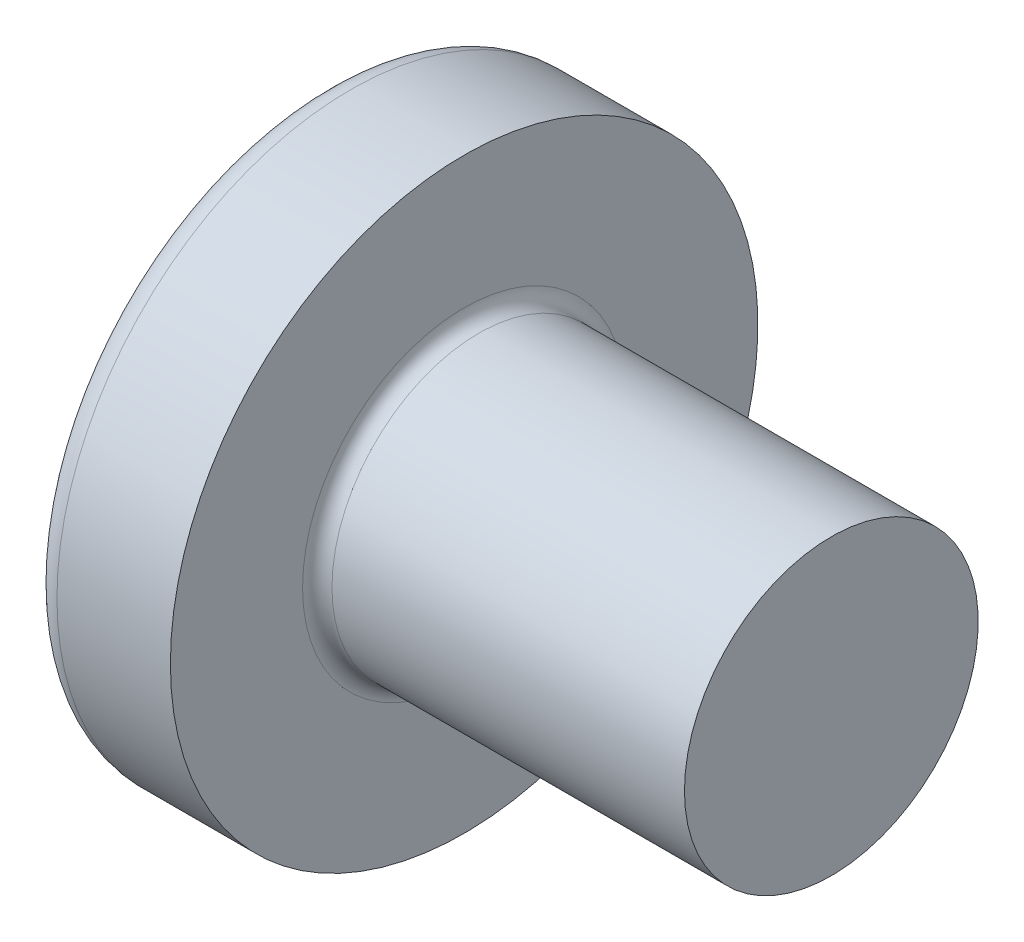
ISO-10303-21;
HEADER;
FILE_DESCRIPTION(('STEP AP214'),'2;1');
FILE_NAME('part.step','',(''),(''),'','','');
FILE_SCHEMA(('AUTOMOTIVE_DESIGN { 1 0 10303 214 1 1 1 1 }'));
ENDSEC;
DATA;
#1=APPLICATION_CONTEXT('core data for automotive mechanical design processes');
#2=APPLICATION_PROTOCOL_DEFINITION('international standard','automotive_design',2000,#1);
#3=PRODUCT_CONTEXT('',#1,'mechanical');
#4=PRODUCT('Part','Part','',(#3));
#5=PRODUCT_RELATED_PRODUCT_CATEGORY('part','',(#4));
#6=PRODUCT_DEFINITION_FORMATION('','',#4);
#7=PRODUCT_DEFINITION_CONTEXT('part definition',#1,'design');
#8=PRODUCT_DEFINITION('design','',#6,#7);
#9=PRODUCT_DEFINITION_SHAPE('','',#8);
#10=(LENGTH_UNIT() NAMED_UNIT(*) SI_UNIT(.MILLI.,.METRE.));
#11=(NAMED_UNIT(*) PLANE_ANGLE_UNIT() SI_UNIT($,.RADIAN.));
#12=(NAMED_UNIT(*) SI_UNIT($,.STERADIAN.) SOLID_ANGLE_UNIT());
#13=UNCERTAINTY_MEASURE_WITH_UNIT(LENGTH_MEASURE(1.E-05),#10,'distance_accuracy_value','');
#14=(GEOMETRIC_REPRESENTATION_CONTEXT(3) GLOBAL_UNCERTAINTY_ASSIGNED_CONTEXT((#13)) GLOBAL_UNIT_ASSIGNED_CONTEXT((#10,
#11,#12)) REPRESENTATION_CONTEXT('',''));
#15=CARTESIAN_POINT('',(0.,0.,0.));
#16=DIRECTION('',(0.,0.,1.));
#17=DIRECTION('',(1.,0.,0.));
#18=AXIS2_PLACEMENT_3D('',#15,#16,#17);
#19=CARTESIAN_POINT('',(6.5,0.,0.));
#20=DIRECTION('',(-1.,0.,0.));
#21=DIRECTION('',(0.,1.,0.));
#22=AXIS2_PLACEMENT_3D('',#19,#20,#21);
#23=SPHERICAL_SURFACE('',#22,6.5);
#24=CARTESIAN_POINT('',(1.26538895452803,0.,0.));
#25=DIRECTION('',(-1.,0.,0.));
#26=DIRECTION('',(0.,0.,1.));
#27=AXIS2_PLACEMENT_3D('',#24,#25,#26);
#28=CIRCLE('',#27,3.85342019543974);
#29=CARTESIAN_POINT('',(1.26538895452803,0.,3.85342019543974));
#30=VERTEX_POINT('',#29);
#31=EDGE_CURVE('E214',#30,#30,#28,.T.);
#32=ORIENTED_EDGE('',*,*,#31,.T.);
#33=EDGE_LOOP('',(#32));
#34=FACE_BOUND('',#33,.T.);
#35=CARTESIAN_POINT('',(0.0788099820016241,0.,0.));
#36=DIRECTION('',(1.,0.,0.));
#37=DIRECTION('',(0.,0.,-1.));
#38=AXIS2_PLACEMENT_3D('',#35,#36,#37);
#39=CIRCLE('',#38,1.0091178091571);
#40=CARTESIAN_POINT('',(0.0788099820016231,-0.514999999999997,-0.867809744562728));
#41=VERTEX_POINT('',#40);
#42=CARTESIAN_POINT('',(0.0788099820016245,-0.86780974456273,-0.515));
#43=VERTEX_POINT('',#42);
#44=EDGE_CURVE('E341',#41,#43,#39,.F.);
#45=ORIENTED_EDGE('',*,*,#44,.F.);
#46=CARTESIAN_POINT('',(6.5,-0.515,0.));
#47=DIRECTION('',(0.,1.,0.));
#48=DIRECTION('',(0.,0.,1.));
#49=AXIS2_PLACEMENT_3D('',#46,#47,#48);
#50=CIRCLE('',#49,6.47956595768575);
#51=CARTESIAN_POINT('',(0.331830520157853,-0.514999999999993,-1.98455543332603));
#52=VERTEX_POINT('',#51);
#53=EDGE_CURVE('E274',#52,#41,#50,.T.);
#54=ORIENTED_EDGE('',*,*,#53,.F.);
#55=CARTESIAN_POINT('',(6.06443225879603,0.,0.873613881878153));
#56=DIRECTION('',(0.446197753347436,0.,-0.894934391398443));
#57=DIRECTION('',(-0.894934391398442,0.,-0.446197753347436));
#58=AXIS2_PLACEMENT_3D('',#55,#56,#57);
#59=CIRCLE('',#58,6.42628038045433);
#60=CARTESIAN_POINT('',(0.331830520157853,0.515000000000007,-1.98455543332603));
#61=VERTEX_POINT('',#60);
#62=EDGE_CURVE('E248',#52,#61,#59,.T.);
#63=ORIENTED_EDGE('',*,*,#62,.T.);
#64=CARTESIAN_POINT('',(6.5,0.515,0.));
#65=DIRECTION('',(0.,-1.,0.));
#66=DIRECTION('',(0.,0.,-1.));
#67=AXIS2_PLACEMENT_3D('',#64,#65,#66);
#68=CIRCLE('',#67,6.47956595768575);
#69=CARTESIAN_POINT('',(0.0788099820016234,0.515000000000003,-0.867809744562724));
#70=VERTEX_POINT('',#69);
#71=EDGE_CURVE('E303',#70,#61,#68,.T.);
#72=ORIENTED_EDGE('',*,*,#71,.F.);
#73=CARTESIAN_POINT('',(0.0788099820016245,0.86780974456273,-0.515));
#74=VERTEX_POINT('',#73);
#75=EDGE_CURVE('E356',#74,#70,#39,.F.);
#76=ORIENTED_EDGE('',*,*,#75,.F.);
#77=CARTESIAN_POINT('',(6.5,0.,-0.515));
#78=DIRECTION('',(0.,0.,1.));
#79=DIRECTION('',(1.,0.,0.));
#80=AXIS2_PLACEMENT_3D('',#77,#78,#79);
#81=CIRCLE('',#80,6.47956595768575);
#82=CARTESIAN_POINT('',(0.331830520157854,1.98455543332603,-0.515));
#83=VERTEX_POINT('',#82);
#84=EDGE_CURVE('E242',#83,#74,#81,.T.);
#85=ORIENTED_EDGE('',*,*,#84,.F.);
#86=CARTESIAN_POINT('',(6.06443225879603,-0.873613881878153,0.));
#87=DIRECTION('',(0.446197753347436,0.894934391398443,0.));
#88=DIRECTION('',(-0.894934391398442,0.446197753347436,0.));
#89=AXIS2_PLACEMENT_3D('',#86,#87,#88);
#90=CIRCLE('',#89,6.42628038045433);
#91=CARTESIAN_POINT('',(0.331830520157854,1.98455543332603,0.515));
#92=VERTEX_POINT('',#91);
#93=EDGE_CURVE('E245',#83,#92,#90,.T.);
#94=ORIENTED_EDGE('',*,*,#93,.T.);
#95=CARTESIAN_POINT('',(6.5,0.,0.515));
#96=DIRECTION('',(0.,0.,-1.));
#97=DIRECTION('',(0.,1.,0.));
#98=AXIS2_PLACEMENT_3D('',#95,#96,#97);
#99=CIRCLE('',#98,6.47956595768575);
#100=CARTESIAN_POINT('',(0.0788099820016245,0.86780974456273,0.515));
#101=VERTEX_POINT('',#100);
#102=EDGE_CURVE('E238',#101,#92,#99,.T.);
#103=ORIENTED_EDGE('',*,*,#102,.F.);
#104=CARTESIAN_POINT('',(0.0788099820016232,0.514999999999997,0.867809744562728));
#105=VERTEX_POINT('',#104);
#106=EDGE_CURVE('E355',#105,#101,#39,.F.);
#107=ORIENTED_EDGE('',*,*,#106,.F.);
#108=CARTESIAN_POINT('',(0.331830520157854,0.514999999999993,1.98455543332604));
#109=VERTEX_POINT('',#108);
#110=EDGE_CURVE('E258',#109,#105,#68,.T.);
#111=ORIENTED_EDGE('',*,*,#110,.F.);
#112=CARTESIAN_POINT('',(6.06443225879603,0.,-0.873613881878153));
#113=DIRECTION('',(0.446197753347436,0.,0.894934391398443));
#114=DIRECTION('',(0.894934391398442,0.,-0.446197753347436));
#115=AXIS2_PLACEMENT_3D('',#112,#113,#114);
#116=CIRCLE('',#115,6.42628038045433);
#117=CARTESIAN_POINT('',(0.331830520157854,-0.515000000000007,1.98455543332603));
#118=VERTEX_POINT('',#117);
#119=EDGE_CURVE('E49',#109,#118,#116,.T.);
#120=ORIENTED_EDGE('',*,*,#119,.T.);
#121=CARTESIAN_POINT('',(0.0788099820016235,-0.515000000000003,0.867809744562724));
#122=VERTEX_POINT('',#121);
#123=EDGE_CURVE('E255',#122,#118,#50,.T.);
#124=ORIENTED_EDGE('',*,*,#123,.F.);
#125=CARTESIAN_POINT('',(0.0788099820016245,-0.86780974456273,0.515));
#126=VERTEX_POINT('',#125);
#127=EDGE_CURVE('E391',#126,#122,#39,.F.);
#128=ORIENTED_EDGE('',*,*,#127,.F.);
#129=CARTESIAN_POINT('',(0.331830520157853,-1.98455543332603,0.515));
#130=VERTEX_POINT('',#129);
#131=EDGE_CURVE('E239',#130,#126,#99,.T.);
#132=ORIENTED_EDGE('',*,*,#131,.F.);
#133=CARTESIAN_POINT('',(6.06443225879603,0.873613881878153,0.));
#134=DIRECTION('',(0.446197753347436,-0.894934391398443,0.));
#135=DIRECTION('',(0.894934391398442,0.446197753347436,0.));
#136=AXIS2_PLACEMENT_3D('',#133,#134,#135);
#137=CIRCLE('',#136,6.42628038045433);
#138=CARTESIAN_POINT('',(0.331830520157853,-1.98455543332603,-0.515));
#139=VERTEX_POINT('',#138);
#140=EDGE_CURVE('E235',#130,#139,#137,.T.);
#141=ORIENTED_EDGE('',*,*,#140,.T.);
#142=EDGE_CURVE('E64',#43,#139,#81,.T.);
#143=ORIENTED_EDGE('',*,*,#142,.F.);
#144=EDGE_LOOP('',(#45,#54,#63,#72,#76,#85,#94,#103,#107,#111,#120,#124,#128,#132,#141,#143));
#145=FACE_BOUND('',#144,.T.);
#146=ADVANCED_FACE('F35',(#34,#145),#23,.T.);
#147=CARTESIAN_POINT('',(0.,2.15,-0.515));
#148=DIRECTION('',(0.,0.,1.));
#149=DIRECTION('',(1.,0.,0.));
#150=AXIS2_PLACEMENT_3D('',#147,#148,#149);
#151=PLANE('',#150);
#152=ORIENTED_EDGE('',*,*,#84,.T.);
#153=CARTESIAN_POINT('',(-1.51195208675156,0.994972220320188,-0.515));
#154=CARTESIAN_POINT('',(-1.2040598194928,0.970722016949958,-0.515));
#155=CARTESIAN_POINT('',(-0.896180907521175,0.946299109919651,-0.515));
#156=CARTESIAN_POINT('',(-0.280449079832186,0.896981122427851,-0.515));
#157=CARTESIAN_POINT('',(0.0274038344396859,0.872086023934883,-0.515));
#158=CARTESIAN_POINT('',(0.48914673951535,0.83429553519528,-0.515));
#159=CARTESIAN_POINT('',(0.643055047553845,0.821624058404092,-0.515));
#160=CARTESIAN_POINT('',(0.950856520197139,0.796108332639504,-0.515));
#161=CARTESIAN_POINT('',(1.10474968487868,0.783264084592466,-0.515));
#162=CARTESIAN_POINT('',(1.41251352095103,0.757376569093378,-0.515));
#163=CARTESIAN_POINT('',(1.56638419296577,0.744333309065218,-0.515));
#164=CARTESIAN_POINT('',(1.87410847343335,0.718013273188896,-0.515));
#165=CARTESIAN_POINT('',(2.02796208151372,0.704736492982792,-0.515));
#166=CARTESIAN_POINT('',(2.36455311890989,0.675386943006726,-0.515));
#167=CARTESIAN_POINT('',(2.54728562293342,0.659257575640986,-0.515));
#168=CARTESIAN_POINT('',(2.91270624109256,0.626517182479888,-0.515));
#169=CARTESIAN_POINT('',(3.09539435554038,0.609906160177238,-0.515));
#170=CARTESIAN_POINT('',(3.46069832191613,0.576073027116421,-0.515));
#171=CARTESIAN_POINT('',(3.64331417870068,0.558850968932727,-0.515));
#172=CARTESIAN_POINT('',(4.00847437496567,0.523604864540037,-0.515));
#173=CARTESIAN_POINT('',(4.19101871216888,0.505580794604253,-0.515));
#174=CARTESIAN_POINT('',(4.55606208157937,0.468429191666488,-0.515));
#175=CARTESIAN_POINT('',(4.73856107358023,0.449301262281853,-0.515));
#176=CARTESIAN_POINT('',(5.10337547353419,0.409473604748924,-0.515));
#177=CARTESIAN_POINT('',(5.28569089526422,0.388774005106069,-0.515));
#178=CARTESIAN_POINT('',(5.55897278495412,0.355828287527264,-0.515));
#179=CARTESIAN_POINT('',(5.65005277419686,0.344527918782738,-0.515));
#180=CARTESIAN_POINT('',(5.83209904103608,0.321075174263031,-0.515));
#181=CARTESIAN_POINT('',(5.92306532397915,0.308922840209686,-0.515));
#182=CARTESIAN_POINT('',(6.10486078872898,0.28342733445193,-0.515));
#183=CARTESIAN_POINT('',(6.1956899229938,0.270083817601714,-0.515));
#184=CARTESIAN_POINT('',(6.33172773785679,0.248701420809951,-0.515));
#185=CARTESIAN_POINT('',(6.37704304473344,0.241345446705304,-0.515));
#186=CARTESIAN_POINT('',(6.4675722520141,0.226018953559338,-0.515));
#187=CARTESIAN_POINT('',(6.51278614568083,0.218048394864476,-0.515));
#188=CARTESIAN_POINT('',(6.55793125759549,0.209691465274944,-0.515));
#189=B_SPLINE_CURVE_WITH_KNOTS('',3,(#153,#154,#155,#156,#157,#158,#159,#160,#161,#162,#163,
#164,#165,#166,#167,#168,#169,#170,#171,#172,#173,#174,#175,#176,#177,#178,#179,#180,#181,#182,
#183,#184,#185,#186,#187,#188),.UNSPECIFIED.,.F.,.F.,(4,2,2,2,2,2,2,2,2,2,2,2,2,2,2,2,2,4),(0.,
0.926537709781721,1.85311087258339,2.31639796016285,2.77968256468771,3.24294992902055,
3.70622594801777,4.25655436065378,4.80687878359543,5.35715597005738,5.90744944680718,
6.45794177197673,7.008389135274,7.28372117336899,7.55903973750591,7.83443833587749,
7.97216007460855,8.10989070671571),.UNSPECIFIED.);
#190=CARTESIAN_POINT('',(2.34,0.677477674908923,-0.515));
#191=VERTEX_POINT('',#190);
#192=EDGE_CURVE('E378',#74,#191,#189,.T.);
#193=ORIENTED_EDGE('',*,*,#192,.T.);
#194=DIRECTION('',(0.,1.,0.));
#195=VECTOR('',#194,1.);
#196=CARTESIAN_POINT('',(2.34,-0.983319232260742,-0.515));
#197=LINE('',#196,#195);
#198=CARTESIAN_POINT('',(2.34,0.983319232260743,-0.515));
#199=VERTEX_POINT('',#198);
#200=EDGE_CURVE('E324',#191,#199,#197,.T.);
#201=ORIENTED_EDGE('',*,*,#200,.T.);
#202=DIRECTION('',(0.894934391398442,-0.446197753347436,0.));
#203=VECTOR('',#202,1.);
#204=CARTESIAN_POINT('',(0.,2.15,-0.515));
#205=LINE('',#204,#203);
#206=EDGE_CURVE('E215',#83,#199,#205,.T.);
#207=ORIENTED_EDGE('',*,*,#206,.F.);
#208=EDGE_LOOP('',(#152,#193,#201,#207));
#209=FACE_BOUND('',#208,.T.);
#210=ADVANCED_FACE('F170',(#209),#151,.T.);
#211=CARTESIAN_POINT('',(2.34,-0.983319232260742,-0.515));
#212=VERTEX_POINT('',#211);
#213=CARTESIAN_POINT('',(2.34,-0.677477674908923,-0.515));
#214=VERTEX_POINT('',#213);
#215=EDGE_CURVE('E223',#212,#214,#197,.T.);
#216=ORIENTED_EDGE('',*,*,#215,.T.);
#217=CARTESIAN_POINT('',(-1.51195208675156,-0.994972220320188,-0.515));
#218=CARTESIAN_POINT('',(-1.2040598194928,-0.970722016949958,-0.515));
#219=CARTESIAN_POINT('',(-0.896180907521175,-0.946299109919651,-0.515));
#220=CARTESIAN_POINT('',(-0.280449079832186,-0.896981122427851,-0.515));
#221=CARTESIAN_POINT('',(0.0274038344396859,-0.872086023934883,-0.515));
#222=CARTESIAN_POINT('',(0.489146739515349,-0.83429553519528,-0.515));
#223=CARTESIAN_POINT('',(0.643055047553845,-0.821624058404092,-0.515));
#224=CARTESIAN_POINT('',(0.950856520197139,-0.796108332639504,-0.515));
#225=CARTESIAN_POINT('',(1.10474968487868,-0.783264084592466,-0.515));
#226=CARTESIAN_POINT('',(1.41251352095103,-0.757376569093378,-0.515));
#227=CARTESIAN_POINT('',(1.56638419296577,-0.744333309065218,-0.515));
#228=CARTESIAN_POINT('',(1.87410847343335,-0.718013273188896,-0.515));
#229=CARTESIAN_POINT('',(2.02796208151372,-0.704736492982792,-0.515));
#230=CARTESIAN_POINT('',(2.36455311890989,-0.675386943006726,-0.515));
#231=CARTESIAN_POINT('',(2.54728562293342,-0.659257575640986,-0.515));
#232=CARTESIAN_POINT('',(2.91270624109256,-0.626517182479888,-0.515));
#233=CARTESIAN_POINT('',(3.09539435554038,-0.609906160177238,-0.515));
#234=CARTESIAN_POINT('',(3.46069832191613,-0.576073027116421,-0.515));
#235=CARTESIAN_POINT('',(3.64331417870068,-0.558850968932727,-0.515));
#236=CARTESIAN_POINT('',(4.00847437496567,-0.523604864540037,-0.515));
#237=CARTESIAN_POINT('',(4.19101871216888,-0.505580794604253,-0.515));
#238=CARTESIAN_POINT('',(4.55606208157937,-0.468429191666488,-0.515));
#239=CARTESIAN_POINT('',(4.73856107358023,-0.449301262281853,-0.515));
#240=CARTESIAN_POINT('',(5.10337547353419,-0.409473604748924,-0.515));
#241=CARTESIAN_POINT('',(5.28569089526422,-0.388774005106069,-0.515));
#242=CARTESIAN_POINT('',(5.55897278495412,-0.355828287527264,-0.515));
#243=CARTESIAN_POINT('',(5.65005277419686,-0.344527918782738,-0.515));
#244=CARTESIAN_POINT('',(5.83209904103608,-0.321075174263031,-0.515));
#245=CARTESIAN_POINT('',(5.92306532397915,-0.308922840209686,-0.515));
#246=CARTESIAN_POINT('',(6.10486078872898,-0.28342733445193,-0.515));
#247=CARTESIAN_POINT('',(6.1956899229938,-0.270083817601714,-0.515));
#248=CARTESIAN_POINT('',(6.3317277378568,-0.24870142080995,-0.515));
#249=CARTESIAN_POINT('',(6.37704304473344,-0.241345446705304,-0.515));
#250=CARTESIAN_POINT('',(6.4675722520141,-0.226018953559337,-0.515));
#251=CARTESIAN_POINT('',(6.51278614568083,-0.218048394864476,-0.515));
#252=CARTESIAN_POINT('',(6.55793125759549,-0.209691465274944,-0.515));
#253=B_SPLINE_CURVE_WITH_KNOTS('',3,(#217,#218,#219,#220,#221,#222,#223,#224,#225,#226,#227,
#228,#229,#230,#231,#232,#233,#234,#235,#236,#237,#238,#239,#240,#241,#242,#243,#244,#245,#246,
#247,#248,#249,#250,#251,#252),.UNSPECIFIED.,.F.,.F.,(4,2,2,2,2,2,2,2,2,2,2,2,2,2,2,2,2,4),(0.,
0.926537709781721,1.85311087258339,2.31639796016285,2.77968256468771,3.24294992902055,
3.70622594801777,4.25655436065378,4.80687878359543,5.35715597005738,5.90744944680718,
6.45794177197674,7.008389135274,7.28372117336899,7.55903973750591,7.83443833587749,
7.97216007460855,8.10989070671572),.UNSPECIFIED.);
#254=EDGE_CURVE('E354',#214,#43,#253,.F.);
#255=ORIENTED_EDGE('',*,*,#254,.T.);
#256=ORIENTED_EDGE('',*,*,#142,.T.);
#257=DIRECTION('',(0.894934391398442,0.446197753347436,0.));
#258=VECTOR('',#257,1.);
#259=CARTESIAN_POINT('',(0.,-2.15,-0.515));
#260=LINE('',#259,#258);
#261=EDGE_CURVE('E306',#139,#212,#260,.T.);
#262=ORIENTED_EDGE('',*,*,#261,.T.);
#263=EDGE_LOOP('',(#216,#255,#256,#262));
#264=FACE_BOUND('',#263,.T.);
#265=ADVANCED_FACE('F176',(#264),#151,.T.);
#266=CARTESIAN_POINT('',(0.,-2.15,0.515));
#267=DIRECTION('',(0.,0.,-1.));
#268=DIRECTION('',(0.,1.,0.));
#269=AXIS2_PLACEMENT_3D('',#266,#267,#268);
#270=PLANE('',#269);
#271=DIRECTION('',(0.,-1.,0.));
#272=VECTOR('',#271,1.);
#273=CARTESIAN_POINT('',(2.34,0.983319232260742,0.515));
#274=LINE('',#273,#272);
#275=CARTESIAN_POINT('',(2.34,0.983319232260743,0.515));
#276=VERTEX_POINT('',#275);
#277=CARTESIAN_POINT('',(2.34,0.677477674908923,0.515));
#278=VERTEX_POINT('',#277);
#279=EDGE_CURVE('E314',#276,#278,#274,.T.);
#280=ORIENTED_EDGE('',*,*,#279,.T.);
#281=CARTESIAN_POINT('',(-1.51195208754038,0.994972220382297,0.515));
#282=CARTESIAN_POINT('',(-1.20405982018868,0.970722017005064,0.515));
#283=CARTESIAN_POINT('',(-0.896180908124146,0.946299109967689,0.515));
#284=CARTESIAN_POINT('',(-0.280449080249314,0.896981122461527,0.515));
#285=CARTESIAN_POINT('',(0.0274038341154836,0.872086023961265,0.515));
#286=CARTESIAN_POINT('',(0.489146739371407,0.834295535207136,0.515));
#287=CARTESIAN_POINT('',(0.643055047497243,0.821624058408796,0.515));
#288=CARTESIAN_POINT('',(0.950856520315202,0.796108332629706,0.515));
#289=CARTESIAN_POINT('',(1.10474968508407,0.783264084575317,0.515));
#290=CARTESIAN_POINT('',(1.41251352133103,0.757376569061287,0.515));
#291=CARTESIAN_POINT('',(1.56638419343305,0.744333309025534,0.515));
#292=CARTESIAN_POINT('',(1.87410847407519,0.718013273133716,0.515));
#293=CARTESIAN_POINT('',(2.02796208224283,0.70473649291971,0.515));
#294=CARTESIAN_POINT('',(2.36455311972626,0.675386942934956,0.515));
#295=CARTESIAN_POINT('',(2.5472856237498,0.659257575568568,0.515));
#296=CARTESIAN_POINT('',(2.91270624190895,0.626517182406014,0.515));
#297=CARTESIAN_POINT('',(3.09539435635676,0.609906160102554,0.515));
#298=CARTESIAN_POINT('',(3.46069832273244,0.576073027039889,0.515));
#299=CARTESIAN_POINT('',(3.64331417951694,0.558850968855156,0.515));
#300=CARTESIAN_POINT('',(4.00847437578178,0.523604864460044,0.515));
#301=CARTESIAN_POINT('',(4.1910187129849,0.505580794522876,0.515));
#302=CARTESIAN_POINT('',(4.55606208239526,0.46842919158178,0.515));
#303=CARTESIAN_POINT('',(4.73856107439606,0.449301262195198,0.515));
#304=CARTESIAN_POINT('',(5.10337547434977,0.409473604657435,0.515));
#305=CARTESIAN_POINT('',(5.28569089607961,0.388774005011695,0.515));
#306=CARTESIAN_POINT('',(5.55897278576906,0.355828287427082,0.515));
#307=CARTESIAN_POINT('',(5.65005277501166,0.344527918680368,0.515));
#308=CARTESIAN_POINT('',(5.83209904185046,0.321075174155499,0.515));
#309=CARTESIAN_POINT('',(5.92306532479326,0.30892284009918,0.515));
#310=CARTESIAN_POINT('',(6.10486078954238,0.283427334334152,0.515));
#311=CARTESIAN_POINT('',(6.19568992380676,0.270083817479637,0.515));
#312=CARTESIAN_POINT('',(6.33172773866874,0.248701420679479,0.515));
#313=CARTESIAN_POINT('',(6.377043045545,0.241345446571707,0.515));
#314=CARTESIAN_POINT('',(6.46757225282466,0.226018953418423,0.515));
#315=CARTESIAN_POINT('',(6.51278614649077,0.218048394719368,0.515));
#316=CARTESIAN_POINT('',(6.55793125840465,0.209691465124901,0.515));
#317=B_SPLINE_CURVE_WITH_KNOTS('',3,(#281,#282,#283,#284,#285,#286,#287,#288,#289,#290,#291,
#292,#293,#294,#295,#296,#297,#298,#299,#300,#301,#302,#303,#304,#305,#306,#307,#308,#309,#310,
#311,#312,#313,#314,#315,#316),.UNSPECIFIED.,.F.,.F.,(4,2,2,2,2,2,2,2,2,2,2,2,2,2,2,2,2,4),(0.,
0.926537710061278,1.85311087314258,2.31639796098494,2.77968256577269,3.24294993036838,
3.70622594962848,4.2565543622647,4.80687878520654,5.3571559716686,5.90744944841855,
6.45794177358856,7.00838913688619,7.28372117498157,7.55903973911884,7.83443833749096,
7.97216007622236,8.10989070832989),.UNSPECIFIED.);
#318=EDGE_CURVE('E279',#278,#101,#317,.F.);
#319=ORIENTED_EDGE('',*,*,#318,.T.);
#320=ORIENTED_EDGE('',*,*,#102,.T.);
#321=DIRECTION('',(0.894934391398442,-0.446197753347436,0.));
#322=VECTOR('',#321,1.);
#323=CARTESIAN_POINT('',(0.,2.15,0.515));
#324=LINE('',#323,#322);
#325=EDGE_CURVE('E220',#92,#276,#324,.T.);
#326=ORIENTED_EDGE('',*,*,#325,.T.);
#327=EDGE_LOOP('',(#280,#319,#320,#326));
#328=FACE_BOUND('',#327,.T.);
#329=ADVANCED_FACE('F374',(#328),#270,.T.);
#330=ORIENTED_EDGE('',*,*,#131,.T.);
#331=CARTESIAN_POINT('',(-1.51195208754038,-0.994972220382298,0.515));
#332=CARTESIAN_POINT('',(-1.20405982018868,-0.970722017005064,0.515));
#333=CARTESIAN_POINT('',(-0.896180908124145,-0.946299109967689,0.515));
#334=CARTESIAN_POINT('',(-0.280449080249314,-0.896981122461527,0.515));
#335=CARTESIAN_POINT('',(0.0274038341154838,-0.872086023961265,0.515));
#336=CARTESIAN_POINT('',(0.489146739371407,-0.834295535207137,0.515));
#337=CARTESIAN_POINT('',(0.643055047497243,-0.821624058408796,0.515));
#338=CARTESIAN_POINT('',(0.950856520315202,-0.796108332629706,0.515));
#339=CARTESIAN_POINT('',(1.10474968508407,-0.783264084575318,0.515));
#340=CARTESIAN_POINT('',(1.41251352133103,-0.757376569061287,0.515));
#341=CARTESIAN_POINT('',(1.56638419343305,-0.744333309025534,0.515));
#342=CARTESIAN_POINT('',(1.87410847407519,-0.718013273133716,0.515));
#343=CARTESIAN_POINT('',(2.02796208224282,-0.70473649291971,0.515));
#344=CARTESIAN_POINT('',(2.36455311972626,-0.675386942934956,0.515));
#345=CARTESIAN_POINT('',(2.5472856237498,-0.659257575568568,0.515));
#346=CARTESIAN_POINT('',(2.91270624190895,-0.626517182406014,0.515));
#347=CARTESIAN_POINT('',(3.09539435635676,-0.609906160102555,0.515));
#348=CARTESIAN_POINT('',(3.46069832273244,-0.576073027039889,0.515));
#349=CARTESIAN_POINT('',(3.64331417951694,-0.558850968855157,0.515));
#350=CARTESIAN_POINT('',(4.00847437578178,-0.523604864460044,0.515));
#351=CARTESIAN_POINT('',(4.1910187129849,-0.505580794522876,0.515));
#352=CARTESIAN_POINT('',(4.55606208239526,-0.46842919158178,0.515));
#353=CARTESIAN_POINT('',(4.73856107439606,-0.449301262195198,0.515));
#354=CARTESIAN_POINT('',(5.10337547434977,-0.409473604657435,0.515));
#355=CARTESIAN_POINT('',(5.28569089607961,-0.388774005011695,0.515));
#356=CARTESIAN_POINT('',(5.55897278576906,-0.355828287427082,0.515));
#357=CARTESIAN_POINT('',(5.65005277501166,-0.344527918680369,0.515));
#358=CARTESIAN_POINT('',(5.83209904185046,-0.3210751741555,0.515));
#359=CARTESIAN_POINT('',(5.92306532479326,-0.308922840099181,0.515));
#360=CARTESIAN_POINT('',(6.10486078954238,-0.283427334334153,0.515));
#361=CARTESIAN_POINT('',(6.19568992380676,-0.270083817479638,0.515));
#362=CARTESIAN_POINT('',(6.33172773866873,-0.248701420679479,0.515));
#363=CARTESIAN_POINT('',(6.37704304554499,-0.241345446571708,0.515));
#364=CARTESIAN_POINT('',(6.46757225282465,-0.226018953418424,0.515));
#365=CARTESIAN_POINT('',(6.51278614649077,-0.218048394719369,0.515));
#366=CARTESIAN_POINT('',(6.55793125840465,-0.209691465124902,0.515));
#367=B_SPLINE_CURVE_WITH_KNOTS('',3,(#331,#332,#333,#334,#335,#336,#337,#338,#339,#340,#341,
#342,#343,#344,#345,#346,#347,#348,#349,#350,#351,#352,#353,#354,#355,#356,#357,#358,#359,#360,
#361,#362,#363,#364,#365,#366),.UNSPECIFIED.,.F.,.F.,(4,2,2,2,2,2,2,2,2,2,2,2,2,2,2,2,2,4),(0.,
0.926537710061278,1.85311087314258,2.31639796098494,2.77968256577269,3.24294993036838,
3.70622594962848,4.2565543622647,4.80687878520654,5.3571559716686,5.90744944841855,
6.45794177358856,7.00838913688619,7.28372117498157,7.55903973911884,7.83443833749096,
7.97216007622235,8.10989070832989),.UNSPECIFIED.);
#368=CARTESIAN_POINT('',(2.34,-0.677477674908923,0.515));
#369=VERTEX_POINT('',#368);
#370=EDGE_CURVE('E392',#126,#369,#367,.T.);
#371=ORIENTED_EDGE('',*,*,#370,.T.);
#372=CARTESIAN_POINT('',(2.34,-0.983319232260742,0.515));
#373=VERTEX_POINT('',#372);
#374=EDGE_CURVE('E316',#369,#373,#274,.T.);
#375=ORIENTED_EDGE('',*,*,#374,.T.);
#376=DIRECTION('',(0.894934391398442,0.446197753347436,0.));
#377=VECTOR('',#376,1.);
#378=CARTESIAN_POINT('',(0.,-2.15,0.515));
#379=LINE('',#378,#377);
#380=EDGE_CURVE('E308',#130,#373,#379,.T.);
#381=ORIENTED_EDGE('',*,*,#380,.F.);
#382=EDGE_LOOP('',(#330,#371,#375,#381));
#383=FACE_BOUND('',#382,.T.);
#384=ADVANCED_FACE('F422',(#383),#270,.T.);
#385=CARTESIAN_POINT('',(2.34,0.983319232260742,-0.515));
#386=DIRECTION('',(-1.,0.,0.));
#387=DIRECTION('',(0.,0.,1.));
#388=AXIS2_PLACEMENT_3D('',#385,#386,#387);
#389=PLANE('',#388);
#390=ORIENTED_EDGE('',*,*,#374,.F.);
#391=CARTESIAN_POINT('',(2.34,0.,0.));
#392=DIRECTION('',(-1.,0.,0.));
#393=DIRECTION('',(0.,0.,1.));
#394=AXIS2_PLACEMENT_3D('',#391,#392,#393);
#395=CIRCLE('',#394,0.851);
#396=EDGE_CURVE('E349',#214,#369,#395,.T.);
#397=ORIENTED_EDGE('',*,*,#396,.F.);
#398=ORIENTED_EDGE('',*,*,#215,.F.);
#399=DIRECTION('',(0.,0.,1.));
#400=VECTOR('',#399,1.);
#401=CARTESIAN_POINT('',(2.34,-0.983319232260742,-0.515));
#402=LINE('',#401,#400);
#403=EDGE_CURVE('E311',#212,#373,#402,.T.);
#404=ORIENTED_EDGE('',*,*,#403,.T.);
#405=EDGE_LOOP('',(#390,#397,#398,#404));
#406=FACE_BOUND('',#405,.T.);
#407=ADVANCED_FACE('F415',(#406),#389,.T.);
#408=DIRECTION('',(0.,0.,-1.));
#409=VECTOR('',#408,1.);
#410=CARTESIAN_POINT('',(2.34,-0.515000000000004,0.983319232260741));
#411=LINE('',#410,#409);
#412=CARTESIAN_POINT('',(2.34,-0.514999999999997,-0.677477674908925));
#413=VERTEX_POINT('',#412);
#414=CARTESIAN_POINT('',(2.34,-0.514999999999996,-0.983319232260744));
#415=VERTEX_POINT('',#414);
#416=EDGE_CURVE('E297',#413,#415,#411,.T.);
#417=ORIENTED_EDGE('',*,*,#416,.F.);
#418=CARTESIAN_POINT('',(2.34,0.515000000000002,-0.677477674908921));
#419=VERTEX_POINT('',#418);
#420=EDGE_CURVE('E56',#419,#413,#395,.T.);
#421=ORIENTED_EDGE('',*,*,#420,.F.);
#422=DIRECTION('',(0.,0.,1.));
#423=VECTOR('',#422,1.);
#424=CARTESIAN_POINT('',(2.34,0.515000000000004,-0.983319232260741));
#425=LINE('',#424,#423);
#426=CARTESIAN_POINT('',(2.34,0.515000000000004,-0.983319232260741));
#427=VERTEX_POINT('',#426);
#428=EDGE_CURVE('E300',#427,#419,#425,.T.);
#429=ORIENTED_EDGE('',*,*,#428,.F.);
#430=DIRECTION('',(0.,-1.,0.));
#431=VECTOR('',#430,1.);
#432=CARTESIAN_POINT('',(2.34,0.515000000000004,-0.983319232260741));
#433=LINE('',#432,#431);
#434=EDGE_CURVE('E291',#427,#415,#433,.T.);
#435=ORIENTED_EDGE('',*,*,#434,.T.);
#436=EDGE_LOOP('',(#417,#421,#429,#435));
#437=FACE_BOUND('',#436,.T.);
#438=ADVANCED_FACE('F344',(#437),#389,.T.);
#439=ORIENTED_EDGE('',*,*,#200,.F.);
#440=EDGE_CURVE('E348',#278,#191,#395,.T.);
#441=ORIENTED_EDGE('',*,*,#440,.F.);
#442=ORIENTED_EDGE('',*,*,#279,.F.);
#443=DIRECTION('',(0.,0.,-1.));
#444=VECTOR('',#443,1.);
#445=CARTESIAN_POINT('',(2.34,0.983319232260742,0.515));
#446=LINE('',#445,#444);
#447=EDGE_CURVE('E317',#276,#199,#446,.T.);
#448=ORIENTED_EDGE('',*,*,#447,.T.);
#449=EDGE_LOOP('',(#439,#441,#442,#448));
#450=FACE_BOUND('',#449,.T.);
#451=ADVANCED_FACE('F416',(#450),#389,.T.);
#452=CARTESIAN_POINT('',(0.,0.514999999999993,2.15));
#453=DIRECTION('',(0.,-1.,0.));
#454=DIRECTION('',(1.,0.,0.));
#455=AXIS2_PLACEMENT_3D('',#452,#453,#454);
#456=PLANE('',#455);
#457=ORIENTED_EDGE('',*,*,#110,.T.);
#458=CARTESIAN_POINT('',(-1.51195208754038,0.514999999999997,0.994972220382299));
#459=CARTESIAN_POINT('',(-1.20405982018868,0.514999999999997,0.970722017005066));
#460=CARTESIAN_POINT('',(-0.896180908124145,0.514999999999997,0.94629910996769));
#461=CARTESIAN_POINT('',(-0.280449080249314,0.514999999999997,0.896981122461529));
#462=CARTESIAN_POINT('',(0.0274038341154839,0.514999999999997,0.872086023961266));
#463=CARTESIAN_POINT('',(0.489146739371407,0.514999999999997,0.834295535207138));
#464=CARTESIAN_POINT('',(0.643055047497244,0.514999999999997,0.821624058408798));
#465=CARTESIAN_POINT('',(0.950856520315202,0.514999999999997,0.796108332629707));
#466=CARTESIAN_POINT('',(1.10474968508407,0.514999999999997,0.783264084575319));
#467=CARTESIAN_POINT('',(1.41251352133103,0.514999999999997,0.757376569061289));
#468=CARTESIAN_POINT('',(1.56638419343305,0.514999999999997,0.744333309025536));
#469=CARTESIAN_POINT('',(1.87410847407519,0.514999999999998,0.718013273133717));
#470=CARTESIAN_POINT('',(2.02796208224283,0.514999999999998,0.704736492919711));
#471=CARTESIAN_POINT('',(2.36455311972626,0.514999999999998,0.675386942934957));
#472=CARTESIAN_POINT('',(2.5472856237498,0.514999999999998,0.65925757556857));
#473=CARTESIAN_POINT('',(2.91270624190895,0.514999999999998,0.626517182406015));
#474=CARTESIAN_POINT('',(3.09539435635676,0.514999999999998,0.609906160102556));
#475=CARTESIAN_POINT('',(3.46069832273244,0.514999999999998,0.576073027039891));
#476=CARTESIAN_POINT('',(3.64331417951694,0.514999999999998,0.558850968855158));
#477=CARTESIAN_POINT('',(4.00847437578178,0.514999999999998,0.523604864460046));
#478=CARTESIAN_POINT('',(4.1910187129849,0.514999999999998,0.505580794522878));
#479=CARTESIAN_POINT('',(4.55606208239526,0.514999999999998,0.468429191581782));
#480=CARTESIAN_POINT('',(4.73856107439606,0.514999999999999,0.4493012621952));
#481=CARTESIAN_POINT('',(5.10337547434977,0.514999999999999,0.409473604657437));
#482=CARTESIAN_POINT('',(5.28569089607961,0.514999999999999,0.388774005011696));
#483=CARTESIAN_POINT('',(5.55897278576906,0.514999999999999,0.355828287427084));
#484=CARTESIAN_POINT('',(5.65005277501166,0.514999999999999,0.344527918680371));
#485=CARTESIAN_POINT('',(5.83209904185046,0.514999999999999,0.321075174155502));
#486=CARTESIAN_POINT('',(5.92306532479326,0.514999999999999,0.308922840099183));
#487=CARTESIAN_POINT('',(6.10486078954238,0.514999999999999,0.283427334334154));
#488=CARTESIAN_POINT('',(6.19568992380676,0.514999999999999,0.270083817479639));
#489=CARTESIAN_POINT('',(6.33172773866874,0.514999999999999,0.248701420679481));
#490=CARTESIAN_POINT('',(6.377043045545,0.514999999999999,0.241345446571709));
#491=CARTESIAN_POINT('',(6.46757225282465,0.514999999999999,0.226018953418426));
#492=CARTESIAN_POINT('',(6.51278614649077,0.514999999999999,0.218048394719371));
#493=CARTESIAN_POINT('',(6.55793125840465,0.514999999999999,0.209691465124903));
#494=B_SPLINE_CURVE_WITH_KNOTS('',3,(#458,#459,#460,#461,#462,#463,#464,#465,#466,#467,#468,
#469,#470,#471,#472,#473,#474,#475,#476,#477,#478,#479,#480,#481,#482,#483,#484,#485,#486,#487,
#488,#489,#490,#491,#492,#493),.UNSPECIFIED.,.F.,.F.,(4,2,2,2,2,2,2,2,2,2,2,2,2,2,2,2,2,4),(0.,
0.926537710061278,1.85311087314258,2.31639796098494,2.77968256577269,3.24294993036838,
3.70622594962848,4.2565543622647,4.80687878520654,5.3571559716686,5.90744944841855,
6.45794177358856,7.00838913688619,7.28372117498157,7.55903973911884,7.83443833749096,
7.97216007622236,8.10989070832989),.UNSPECIFIED.);
#495=CARTESIAN_POINT('',(2.34,0.514999999999998,0.677477674908924));
#496=VERTEX_POINT('',#495);
#497=EDGE_CURVE('E440',#105,#496,#494,.T.);
#498=ORIENTED_EDGE('',*,*,#497,.T.);
#499=CARTESIAN_POINT('',(2.34,0.514999999999997,0.983319232260744));
#500=VERTEX_POINT('',#499);
#501=EDGE_CURVE('E272',#496,#500,#425,.T.);
#502=ORIENTED_EDGE('',*,*,#501,.T.);
#503=DIRECTION('',(0.894934391398442,0.,-0.446197753347436));
#504=VECTOR('',#503,1.);
#505=CARTESIAN_POINT('',(0.,0.514999999999993,2.15));
#506=LINE('',#505,#504);
#507=EDGE_CURVE('E265',#109,#500,#506,.T.);
#508=ORIENTED_EDGE('',*,*,#507,.F.);
#509=EDGE_LOOP('',(#457,#498,#502,#508));
#510=FACE_BOUND('',#509,.T.);
#511=ADVANCED_FACE('F269',(#510),#456,.T.);
#512=CARTESIAN_POINT('',(0.,-0.514999999999992,-2.15));
#513=DIRECTION('',(0.,1.,0.));
#514=DIRECTION('',(0.,0.,1.));
#515=AXIS2_PLACEMENT_3D('',#512,#513,#514);
#516=PLANE('',#515);
#517=CARTESIAN_POINT('',(2.34,-0.515000000000004,0.983319232260741));
#518=VERTEX_POINT('',#517);
#519=CARTESIAN_POINT('',(2.34,-0.515000000000003,0.677477674908921));
#520=VERTEX_POINT('',#519);
#521=EDGE_CURVE('E294',#518,#520,#411,.T.);
#522=ORIENTED_EDGE('',*,*,#521,.T.);
#523=CARTESIAN_POINT('',(-1.51195208675156,-0.515000000000004,0.994972220320186));
#524=CARTESIAN_POINT('',(-1.2040598194928,-0.515000000000003,0.970722016949956));
#525=CARTESIAN_POINT('',(-0.896180907521175,-0.515000000000003,0.946299109919649));
#526=CARTESIAN_POINT('',(-0.280449079832187,-0.515000000000003,0.89698112242785));
#527=CARTESIAN_POINT('',(0.0274038344396858,-0.515000000000003,0.872086023934881));
#528=CARTESIAN_POINT('',(0.489146739515349,-0.515000000000003,0.834295535195278));
#529=CARTESIAN_POINT('',(0.643055047553844,-0.515000000000003,0.82162405840409));
#530=CARTESIAN_POINT('',(0.950856520197139,-0.515000000000003,0.796108332639502));
#531=CARTESIAN_POINT('',(1.10474968487868,-0.515000000000003,0.783264084592464));
#532=CARTESIAN_POINT('',(1.41251352095103,-0.515000000000003,0.757376569093377));
#533=CARTESIAN_POINT('',(1.56638419296577,-0.515000000000003,0.744333309065216));
#534=CARTESIAN_POINT('',(1.87410847343335,-0.515000000000003,0.718013273188894));
#535=CARTESIAN_POINT('',(2.02796208151372,-0.515000000000002,0.70473649298279));
#536=CARTESIAN_POINT('',(2.36455311890989,-0.515000000000002,0.675386943006724));
#537=CARTESIAN_POINT('',(2.54728562293342,-0.515000000000002,0.659257575640984));
#538=CARTESIAN_POINT('',(2.91270624109256,-0.515000000000002,0.626517182479886));
#539=CARTESIAN_POINT('',(3.09539435554038,-0.515000000000002,0.609906160177236));
#540=CARTESIAN_POINT('',(3.46069832191613,-0.515000000000002,0.57607302711642));
#541=CARTESIAN_POINT('',(3.64331417870068,-0.515000000000002,0.558850968932725));
#542=CARTESIAN_POINT('',(4.00847437496567,-0.515000000000002,0.523604864540036));
#543=CARTESIAN_POINT('',(4.19101871216888,-0.515000000000002,0.505580794604251));
#544=CARTESIAN_POINT('',(4.55606208157937,-0.515000000000002,0.468429191666486));
#545=CARTESIAN_POINT('',(4.73856107358023,-0.515000000000002,0.449301262281852));
#546=CARTESIAN_POINT('',(5.10337547353419,-0.515000000000001,0.409473604748922));
#547=CARTESIAN_POINT('',(5.28569089526422,-0.515000000000001,0.388774005106068));
#548=CARTESIAN_POINT('',(5.55897278495412,-0.515000000000001,0.355828287527262));
#549=CARTESIAN_POINT('',(5.65005277419686,-0.515000000000001,0.344527918782736));
#550=CARTESIAN_POINT('',(5.83209904103608,-0.515000000000001,0.321075174263029));
#551=CARTESIAN_POINT('',(5.92306532397915,-0.515000000000001,0.308922840209684));
#552=CARTESIAN_POINT('',(6.10486078872898,-0.515000000000001,0.283427334451928));
#553=CARTESIAN_POINT('',(6.1956899229938,-0.515000000000001,0.270083817601712));
#554=CARTESIAN_POINT('',(6.33172773785679,-0.515000000000001,0.248701420809949));
#555=CARTESIAN_POINT('',(6.37704304473344,-0.515000000000001,0.241345446705302));
#556=CARTESIAN_POINT('',(6.4675722520141,-0.515000000000001,0.226018953559336));
#557=CARTESIAN_POINT('',(6.51278614568083,-0.515000000000001,0.218048394864474));
#558=CARTESIAN_POINT('',(6.55793125759549,-0.515000000000001,0.209691465274943));
#559=B_SPLINE_CURVE_WITH_KNOTS('',3,(#523,#524,#525,#526,#527,#528,#529,#530,#531,#532,#533,
#534,#535,#536,#537,#538,#539,#540,#541,#542,#543,#544,#545,#546,#547,#548,#549,#550,#551,#552,
#553,#554,#555,#556,#557,#558),.UNSPECIFIED.,.F.,.F.,(4,2,2,2,2,2,2,2,2,2,2,2,2,2,2,2,2,4),(0.,
0.926537709781721,1.85311087258339,2.31639796016285,2.77968256468771,3.24294992902055,
3.70622594801777,4.25655436065378,4.80687878359543,5.35715597005738,5.90744944680718,
6.45794177197673,7.008389135274,7.28372117336899,7.55903973750591,7.83443833587749,
7.97216007460855,8.10989070671571),.UNSPECIFIED.);
#560=EDGE_CURVE('E384',#520,#122,#559,.F.);
#561=ORIENTED_EDGE('',*,*,#560,.T.);
#562=ORIENTED_EDGE('',*,*,#123,.T.);
#563=DIRECTION('',(0.894934391398442,0.,-0.446197753347436));
#564=VECTOR('',#563,1.);
#565=CARTESIAN_POINT('',(0.,-0.515000000000008,2.15));
#566=LINE('',#565,#564);
#567=EDGE_CURVE('E267',#118,#518,#566,.T.);
#568=ORIENTED_EDGE('',*,*,#567,.T.);
#569=EDGE_LOOP('',(#522,#561,#562,#568));
#570=FACE_BOUND('',#569,.T.);
#571=ADVANCED_FACE('F205',(#570),#516,.T.);
#572=ORIENTED_EDGE('',*,*,#428,.T.);
#573=CARTESIAN_POINT('',(-1.51195208754038,0.515000000000004,-0.994972220382296));
#574=CARTESIAN_POINT('',(-1.20405982018868,0.515000000000003,-0.970722017005062));
#575=CARTESIAN_POINT('',(-0.896180908124145,0.515000000000003,-0.946299109967687));
#576=CARTESIAN_POINT('',(-0.280449080249314,0.515000000000003,-0.896981122461525));
#577=CARTESIAN_POINT('',(0.0274038341154835,0.515000000000003,-0.872086023961263));
#578=CARTESIAN_POINT('',(0.489146739371407,0.515000000000003,-0.834295535207134));
#579=CARTESIAN_POINT('',(0.643055047497243,0.515000000000003,-0.821624058408794));
#580=CARTESIAN_POINT('',(0.950856520315202,0.515000000000003,-0.796108332629704));
#581=CARTESIAN_POINT('',(1.10474968508407,0.515000000000003,-0.783264084575316));
#582=CARTESIAN_POINT('',(1.41251352133103,0.515000000000003,-0.757376569061286));
#583=CARTESIAN_POINT('',(1.56638419343305,0.515000000000003,-0.744333309025532));
#584=CARTESIAN_POINT('',(1.87410847407519,0.515000000000003,-0.718013273133714));
#585=CARTESIAN_POINT('',(2.02796208224282,0.515000000000002,-0.704736492919708));
#586=CARTESIAN_POINT('',(2.36455311972626,0.515000000000002,-0.675386942934954));
#587=CARTESIAN_POINT('',(2.5472856237498,0.515000000000002,-0.659257575568566));
#588=CARTESIAN_POINT('',(2.91270624190895,0.515000000000002,-0.626517182406012));
#589=CARTESIAN_POINT('',(3.09539435635676,0.515000000000002,-0.609906160102553));
#590=CARTESIAN_POINT('',(3.46069832273244,0.515000000000002,-0.576073027039887));
#591=CARTESIAN_POINT('',(3.64331417951694,0.515000000000002,-0.558850968855155));
#592=CARTESIAN_POINT('',(4.00847437578178,0.515000000000002,-0.523604864460042));
#593=CARTESIAN_POINT('',(4.1910187129849,0.515000000000002,-0.505580794522874));
#594=CARTESIAN_POINT('',(4.55606208239526,0.515000000000002,-0.468429191581778));
#595=CARTESIAN_POINT('',(4.73856107439606,0.515000000000002,-0.449301262195196));
#596=CARTESIAN_POINT('',(5.10337547434977,0.515000000000001,-0.409473604657433));
#597=CARTESIAN_POINT('',(5.28569089607961,0.515000000000001,-0.388774005011693));
#598=CARTESIAN_POINT('',(5.55897278576906,0.515000000000001,-0.355828287427081));
#599=CARTESIAN_POINT('',(5.65005277501166,0.515000000000001,-0.344527918680367));
#600=CARTESIAN_POINT('',(5.83209904185046,0.515000000000001,-0.321075174155498));
#601=CARTESIAN_POINT('',(5.92306532479326,0.515000000000001,-0.308922840099179));
#602=CARTESIAN_POINT('',(6.10486078954238,0.515000000000001,-0.283427334334151));
#603=CARTESIAN_POINT('',(6.19568992380676,0.515000000000001,-0.270083817479636));
#604=CARTESIAN_POINT('',(6.33172773866873,0.515000000000001,-0.248701420679477));
#605=CARTESIAN_POINT('',(6.37704304554499,0.515000000000001,-0.241345446571706));
#606=CARTESIAN_POINT('',(6.46757225282465,0.515000000000001,-0.226018953418422));
#607=CARTESIAN_POINT('',(6.51278614649077,0.515000000000001,-0.218048394719367));
#608=CARTESIAN_POINT('',(6.55793125840465,0.515000000000001,-0.2096914651249));
#609=B_SPLINE_CURVE_WITH_KNOTS('',3,(#573,#574,#575,#576,#577,#578,#579,#580,#581,#582,#583,
#584,#585,#586,#587,#588,#589,#590,#591,#592,#593,#594,#595,#596,#597,#598,#599,#600,#601,#602,
#603,#604,#605,#606,#607,#608),.UNSPECIFIED.,.F.,.F.,(4,2,2,2,2,2,2,2,2,2,2,2,2,2,2,2,2,4),(0.,
0.926537710061278,1.85311087314258,2.31639796098494,2.77968256577269,3.24294993036838,
3.70622594962848,4.2565543622647,4.80687878520654,5.3571559716686,5.90744944841855,
6.45794177358856,7.00838913688619,7.28372117498157,7.55903973911884,7.83443833749096,
7.97216007622236,8.10989070832989),.UNSPECIFIED.);
#610=EDGE_CURVE('E333',#419,#70,#609,.F.);
#611=ORIENTED_EDGE('',*,*,#610,.T.);
#612=ORIENTED_EDGE('',*,*,#71,.T.);
#613=DIRECTION('',(0.894934391398442,0.,0.446197753347436));
#614=VECTOR('',#613,1.);
#615=CARTESIAN_POINT('',(0.,0.515000000000008,-2.15));
#616=LINE('',#615,#614);
#617=EDGE_CURVE('E276',#61,#427,#616,.T.);
#618=ORIENTED_EDGE('',*,*,#617,.T.);
#619=EDGE_LOOP('',(#572,#611,#612,#618));
#620=FACE_BOUND('',#619,.T.);
#621=ADVANCED_FACE('F203',(#620),#456,.T.);
#622=ORIENTED_EDGE('',*,*,#53,.T.);
#623=CARTESIAN_POINT('',(-1.51195208754038,-0.514999999999996,-0.994972220382299));
#624=CARTESIAN_POINT('',(-1.20405982018868,-0.514999999999996,-0.970722017005066));
#625=CARTESIAN_POINT('',(-0.896180908124145,-0.514999999999996,-0.946299109967691));
#626=CARTESIAN_POINT('',(-0.280449080249314,-0.514999999999997,-0.896981122461529));
#627=CARTESIAN_POINT('',(0.0274038341154838,-0.514999999999997,-0.872086023961267));
#628=CARTESIAN_POINT('',(0.489146739371407,-0.514999999999997,-0.834295535207138));
#629=CARTESIAN_POINT('',(0.643055047497244,-0.514999999999997,-0.821624058408798));
#630=CARTESIAN_POINT('',(0.950856520315202,-0.514999999999997,-0.796108332629708));
#631=CARTESIAN_POINT('',(1.10474968508407,-0.514999999999997,-0.783264084575319));
#632=CARTESIAN_POINT('',(1.41251352133103,-0.514999999999997,-0.757376569061289));
#633=CARTESIAN_POINT('',(1.56638419343305,-0.514999999999997,-0.744333309025536));
#634=CARTESIAN_POINT('',(1.87410847407519,-0.514999999999997,-0.718013273133717));
#635=CARTESIAN_POINT('',(2.02796208224283,-0.514999999999997,-0.704736492919711));
#636=CARTESIAN_POINT('',(2.36455311972626,-0.514999999999997,-0.675386942934958));
#637=CARTESIAN_POINT('',(2.5472856237498,-0.514999999999998,-0.65925757556857));
#638=CARTESIAN_POINT('',(2.91270624190895,-0.514999999999998,-0.626517182406016));
#639=CARTESIAN_POINT('',(3.09539435635676,-0.514999999999998,-0.609906160102556));
#640=CARTESIAN_POINT('',(3.46069832273244,-0.514999999999998,-0.576073027039891));
#641=CARTESIAN_POINT('',(3.64331417951694,-0.514999999999998,-0.558850968855158));
#642=CARTESIAN_POINT('',(4.00847437578178,-0.514999999999998,-0.523604864460046));
#643=CARTESIAN_POINT('',(4.1910187129849,-0.514999999999998,-0.505580794522878));
#644=CARTESIAN_POINT('',(4.55606208239526,-0.514999999999998,-0.468429191581782));
#645=CARTESIAN_POINT('',(4.73856107439606,-0.514999999999998,-0.4493012621952));
#646=CARTESIAN_POINT('',(5.10337547434977,-0.514999999999999,-0.409473604657437));
#647=CARTESIAN_POINT('',(5.28569089607961,-0.514999999999999,-0.388774005011697));
#648=CARTESIAN_POINT('',(5.55897278576906,-0.514999999999999,-0.355828287427084));
#649=CARTESIAN_POINT('',(5.65005277501166,-0.514999999999999,-0.344527918680371));
#650=CARTESIAN_POINT('',(5.83209904185046,-0.514999999999999,-0.321075174155502));
#651=CARTESIAN_POINT('',(5.92306532479326,-0.514999999999999,-0.308922840099183));
#652=CARTESIAN_POINT('',(6.10486078954238,-0.514999999999999,-0.283427334334155));
#653=CARTESIAN_POINT('',(6.19568992380676,-0.514999999999999,-0.270083817479639));
#654=CARTESIAN_POINT('',(6.33172773866873,-0.514999999999999,-0.248701420679481));
#655=CARTESIAN_POINT('',(6.37704304554499,-0.514999999999999,-0.241345446571709));
#656=CARTESIAN_POINT('',(6.46757225282465,-0.514999999999999,-0.226018953418426));
#657=CARTESIAN_POINT('',(6.51278614649077,-0.514999999999999,-0.218048394719371));
#658=CARTESIAN_POINT('',(6.55793125840465,-0.514999999999999,-0.209691465124904));
#659=B_SPLINE_CURVE_WITH_KNOTS('',3,(#623,#624,#625,#626,#627,#628,#629,#630,#631,#632,#633,
#634,#635,#636,#637,#638,#639,#640,#641,#642,#643,#644,#645,#646,#647,#648,#649,#650,#651,#652,
#653,#654,#655,#656,#657,#658),.UNSPECIFIED.,.F.,.F.,(4,2,2,2,2,2,2,2,2,2,2,2,2,2,2,2,2,4),(0.,
0.926537710061278,1.85311087314258,2.31639796098494,2.77968256577269,3.24294993036838,
3.70622594962848,4.2565543622647,4.80687878520654,5.3571559716686,5.90744944841855,
6.45794177358856,7.00838913688619,7.28372117498157,7.55903973911884,7.83443833749096,
7.97216007622235,8.10989070832989),.UNSPECIFIED.);
#660=EDGE_CURVE('E11',#41,#413,#659,.T.);
#661=ORIENTED_EDGE('',*,*,#660,.T.);
#662=ORIENTED_EDGE('',*,*,#416,.T.);
#663=DIRECTION('',(0.894934391398442,0.,0.446197753347436));
#664=VECTOR('',#663,1.);
#665=CARTESIAN_POINT('',(0.,-0.514999999999992,-2.15));
#666=LINE('',#665,#664);
#667=EDGE_CURVE('E288',#52,#415,#666,.T.);
#668=ORIENTED_EDGE('',*,*,#667,.F.);
#669=EDGE_LOOP('',(#622,#661,#662,#668));
#670=FACE_BOUND('',#669,.T.);
#671=ADVANCED_FACE('F198',(#670),#516,.T.);
#672=CARTESIAN_POINT('',(-25.4,0.,0.));
#673=DIRECTION('',(-1.,0.,0.));
#674=DIRECTION('',(0.,0.,1.));
#675=AXIS2_PLACEMENT_3D('',#672,#673,#674);
#676=CYLINDRICAL_SURFACE('',#675,2.);
#677=CARTESIAN_POINT('',(3.3,0.,0.));
#678=DIRECTION('',(-1.,0.,0.));
#679=DIRECTION('',(0.,0.,1.));
#680=AXIS2_PLACEMENT_3D('',#677,#678,#679);
#681=CIRCLE('',#680,2.);
#682=CARTESIAN_POINT('',(3.3,0.,2.));
#683=VERTEX_POINT('',#682);
#684=EDGE_CURVE('E209',#683,#683,#681,.F.);
#685=ORIENTED_EDGE('',*,*,#684,.T.);
#686=EDGE_LOOP('',(#685));
#687=FACE_BOUND('',#686,.T.);
#688=CARTESIAN_POINT('',(8.1,0.,0.));
#689=DIRECTION('',(-1.,0.,0.));
#690=DIRECTION('',(0.,0.,1.));
#691=AXIS2_PLACEMENT_3D('',#688,#689,#690);
#692=CIRCLE('',#691,2.);
#693=CARTESIAN_POINT('',(8.1,0.,2.));
#694=VERTEX_POINT('',#693);
#695=EDGE_CURVE('E212',#694,#694,#692,.T.);
#696=ORIENTED_EDGE('',*,*,#695,.T.);
#697=EDGE_LOOP('',(#696));
#698=FACE_BOUND('',#697,.T.);
#699=ADVANCED_FACE('F195',(#687,#698),#676,.T.);
#700=CARTESIAN_POINT('',(3.1,2.,0.));
#701=DIRECTION('',(-1.,0.,0.));
#702=DIRECTION('',(0.,0.,1.));
#703=AXIS2_PLACEMENT_3D('',#700,#701,#702);
#704=PLANE('',#703);
#705=CARTESIAN_POINT('',(3.1,0.,0.));
#706=DIRECTION('',(-1.,0.,0.));
#707=DIRECTION('',(0.,0.,1.));
#708=AXIS2_PLACEMENT_3D('',#705,#706,#707);
#709=CIRCLE('',#708,2.2);
#710=CARTESIAN_POINT('',(3.1,0.,2.2));
#711=VERTEX_POINT('',#710);
#712=EDGE_CURVE('E231',#711,#711,#709,.T.);
#713=ORIENTED_EDGE('',*,*,#712,.T.);
#714=EDGE_LOOP('',(#713));
#715=FACE_BOUND('',#714,.T.);
#716=CARTESIAN_POINT('',(3.1,0.,0.));
#717=DIRECTION('',(-1.,0.,0.));
#718=DIRECTION('',(0.,0.,1.));
#719=AXIS2_PLACEMENT_3D('',#716,#717,#718);
#720=CIRCLE('',#719,4.);
#721=CARTESIAN_POINT('',(3.1,0.,4.));
#722=VERTEX_POINT('',#721);
#723=EDGE_CURVE('E228',#722,#722,#720,.T.);
#724=ORIENTED_EDGE('',*,*,#723,.F.);
#725=EDGE_LOOP('',(#724));
#726=FACE_BOUND('',#725,.T.);
#727=ADVANCED_FACE('F192',(#715,#726),#704,.F.);
#728=CARTESIAN_POINT('',(-25.4,0.,0.));
#729=DIRECTION('',(-1.,0.,0.));
#730=DIRECTION('',(0.,0.,1.));
#731=AXIS2_PLACEMENT_3D('',#728,#729,#730);
#732=CYLINDRICAL_SURFACE('',#731,4.);
#733=ORIENTED_EDGE('',*,*,#723,.T.);
#734=EDGE_LOOP('',(#733));
#735=FACE_BOUND('',#734,.T.);
#736=CARTESIAN_POINT('',(1.55530587396955,0.,0.));
#737=DIRECTION('',(-1.,0.,0.));
#738=DIRECTION('',(0.,0.,1.));
#739=AXIS2_PLACEMENT_3D('',#736,#737,#738);
#740=CIRCLE('',#739,4.);
#741=CARTESIAN_POINT('',(1.55530587396955,0.,4.));
#742=VERTEX_POINT('',#741);
#743=EDGE_CURVE('E217',#742,#742,#740,.T.);
#744=ORIENTED_EDGE('',*,*,#743,.F.);
#745=EDGE_LOOP('',(#744));
#746=FACE_BOUND('',#745,.T.);
#747=ADVANCED_FACE('F188',(#735,#746),#732,.T.);
#748=CARTESIAN_POINT('',(1.55530587396955,0.,0.));
#749=DIRECTION('',(-1.,0.,0.));
#750=DIRECTION('',(0.,0.,1.));
#751=AXIS2_PLACEMENT_3D('',#748,#749,#750);
#752=TOROIDAL_SURFACE('',#751,3.64,0.36);
#753=ORIENTED_EDGE('',*,*,#743,.T.);
#754=EDGE_LOOP('',(#753));
#755=FACE_BOUND('',#754,.T.);
#756=ORIENTED_EDGE('',*,*,#31,.F.);
#757=EDGE_LOOP('',(#756));
#758=FACE_BOUND('',#757,.T.);
#759=ADVANCED_FACE('F185',(#755,#758),#752,.T.);
#760=CARTESIAN_POINT('',(8.1,2.,0.));
#761=DIRECTION('',(1.,0.,0.));
#762=DIRECTION('',(0.,0.,-1.));
#763=AXIS2_PLACEMENT_3D('',#760,#761,#762);
#764=PLANE('',#763);
#765=ORIENTED_EDGE('',*,*,#695,.F.);
#766=EDGE_LOOP('',(#765));
#767=FACE_BOUND('',#766,.T.);
#768=ADVANCED_FACE('F183',(#767),#764,.T.);
#769=CARTESIAN_POINT('',(3.3,0.,0.));
#770=DIRECTION('',(-1.,0.,0.));
#771=DIRECTION('',(0.,0.,1.));
#772=AXIS2_PLACEMENT_3D('',#769,#770,#771);
#773=TOROIDAL_SURFACE('',#772,2.2,0.2);
#774=ORIENTED_EDGE('',*,*,#684,.F.);
#775=EDGE_LOOP('',(#774));
#776=FACE_BOUND('',#775,.T.);
#777=ORIENTED_EDGE('',*,*,#712,.F.);
#778=EDGE_LOOP('',(#777));
#779=FACE_BOUND('',#778,.T.);
#780=ADVANCED_FACE('F37',(#776,#779),#773,.F.);
#781=CARTESIAN_POINT('',(2.34,0.983319232260742,0.515));
#782=DIRECTION('',(0.446197753347436,0.894934391398443,0.));
#783=DIRECTION('',(-0.894934391398442,0.446197753347436,0.));
#784=AXIS2_PLACEMENT_3D('',#781,#782,#783);
#785=PLANE('',#784);
#786=ORIENTED_EDGE('',*,*,#206,.T.);
#787=ORIENTED_EDGE('',*,*,#447,.F.);
#788=ORIENTED_EDGE('',*,*,#325,.F.);
#789=ORIENTED_EDGE('',*,*,#93,.F.);
#790=EDGE_LOOP('',(#786,#787,#788,#789));
#791=FACE_BOUND('',#790,.T.);
#792=ADVANCED_FACE('F372',(#791),#785,.F.);
#793=CARTESIAN_POINT('',(2.34,-0.983319232260742,-0.515));
#794=DIRECTION('',(0.446197753347436,-0.894934391398443,0.));
#795=DIRECTION('',(0.894934391398442,0.446197753347436,0.));
#796=AXIS2_PLACEMENT_3D('',#793,#794,#795);
#797=PLANE('',#796);
#798=ORIENTED_EDGE('',*,*,#380,.T.);
#799=ORIENTED_EDGE('',*,*,#403,.F.);
#800=ORIENTED_EDGE('',*,*,#261,.F.);
#801=ORIENTED_EDGE('',*,*,#140,.F.);
#802=EDGE_LOOP('',(#798,#799,#800,#801));
#803=FACE_BOUND('',#802,.T.);
#804=ADVANCED_FACE('F413',(#803),#797,.F.);
#805=ORIENTED_EDGE('',*,*,#501,.F.);
#806=EDGE_CURVE('E352',#520,#496,#395,.T.);
#807=ORIENTED_EDGE('',*,*,#806,.F.);
#808=ORIENTED_EDGE('',*,*,#521,.F.);
#809=DIRECTION('',(0.,1.,0.));
#810=VECTOR('',#809,1.);
#811=CARTESIAN_POINT('',(2.34,-0.515000000000004,0.983319232260741));
#812=LINE('',#811,#810);
#813=EDGE_CURVE('E298',#518,#500,#812,.T.);
#814=ORIENTED_EDGE('',*,*,#813,.T.);
#815=EDGE_LOOP('',(#805,#807,#808,#814));
#816=FACE_BOUND('',#815,.T.);
#817=ADVANCED_FACE('F409',(#816),#389,.T.);
#818=CARTESIAN_POINT('',(2.34,-0.515000000000004,0.983319232260741));
#819=DIRECTION('',(0.446197753347436,0.,0.894934391398443));
#820=DIRECTION('',(-0.894934391398442,0.,0.446197753347436));
#821=AXIS2_PLACEMENT_3D('',#818,#819,#820);
#822=PLANE('',#821);
#823=ORIENTED_EDGE('',*,*,#507,.T.);
#824=ORIENTED_EDGE('',*,*,#813,.F.);
#825=ORIENTED_EDGE('',*,*,#567,.F.);
#826=ORIENTED_EDGE('',*,*,#119,.F.);
#827=EDGE_LOOP('',(#823,#824,#825,#826));
#828=FACE_BOUND('',#827,.T.);
#829=ADVANCED_FACE('F263',(#828),#822,.F.);
#830=CARTESIAN_POINT('',(2.34,0.515000000000004,-0.983319232260741));
#831=DIRECTION('',(0.446197753347436,0.,-0.894934391398443));
#832=DIRECTION('',(0.894934391398442,0.,0.446197753347436));
#833=AXIS2_PLACEMENT_3D('',#830,#831,#832);
#834=PLANE('',#833);
#835=ORIENTED_EDGE('',*,*,#667,.T.);
#836=ORIENTED_EDGE('',*,*,#434,.F.);
#837=ORIENTED_EDGE('',*,*,#617,.F.);
#838=ORIENTED_EDGE('',*,*,#62,.F.);
#839=EDGE_LOOP('',(#835,#836,#837,#838));
#840=FACE_BOUND('',#839,.T.);
#841=ADVANCED_FACE('F336',(#840),#834,.F.);
#842=CARTESIAN_POINT('',(2.34,0.,0.));
#843=DIRECTION('',(-1.,0.,0.));
#844=DIRECTION('',(0.,0.,1.));
#845=AXIS2_PLACEMENT_3D('',#842,#843,#844);
#846=CONICAL_SURFACE('',#845,0.851,0.0698131700797659);
#847=EDGE_CURVE('E350',#496,#278,#395,.T.);
#848=ORIENTED_EDGE('',*,*,#847,.F.);
#849=ORIENTED_EDGE('',*,*,#497,.F.);
#850=ORIENTED_EDGE('',*,*,#106,.T.);
#851=ORIENTED_EDGE('',*,*,#318,.F.);
#852=EDGE_LOOP('',(#848,#849,#850,#851));
#853=FACE_BOUND('',#852,.T.);
#854=ADVANCED_FACE('F167',(#853),#846,.F.);
#855=ORIENTED_EDGE('',*,*,#127,.T.);
#856=ORIENTED_EDGE('',*,*,#560,.F.);
#857=EDGE_CURVE('E449',#369,#520,#395,.T.);
#858=ORIENTED_EDGE('',*,*,#857,.F.);
#859=ORIENTED_EDGE('',*,*,#370,.F.);
#860=EDGE_LOOP('',(#855,#856,#858,#859));
#861=FACE_BOUND('',#860,.T.);
#862=ADVANCED_FACE('F407',(#861),#846,.F.);
#863=ORIENTED_EDGE('',*,*,#75,.T.);
#864=ORIENTED_EDGE('',*,*,#610,.F.);
#865=EDGE_CURVE('E345',#191,#419,#395,.T.);
#866=ORIENTED_EDGE('',*,*,#865,.F.);
#867=ORIENTED_EDGE('',*,*,#192,.F.);
#868=EDGE_LOOP('',(#863,#864,#866,#867));
#869=FACE_BOUND('',#868,.T.);
#870=ADVANCED_FACE('F165',(#869),#846,.F.);
#871=EDGE_CURVE('E346',#413,#214,#395,.T.);
#872=ORIENTED_EDGE('',*,*,#871,.F.);
#873=ORIENTED_EDGE('',*,*,#660,.F.);
#874=ORIENTED_EDGE('',*,*,#44,.T.);
#875=ORIENTED_EDGE('',*,*,#254,.F.);
#876=EDGE_LOOP('',(#872,#873,#874,#875));
#877=FACE_BOUND('',#876,.T.);
#878=ADVANCED_FACE('F160',(#877),#846,.F.);
#879=CARTESIAN_POINT('',(2.6165066614942,0.,0.));
#880=DIRECTION('',(-1.,0.,0.));
#881=DIRECTION('',(0.,0.,1.));
#882=AXIS2_PLACEMENT_3D('',#879,#880,#881);
#883=CONICAL_SURFACE('',#882,0.,1.25663706143592);
#884=ORIENTED_EDGE('',*,*,#847,.T.);
#885=ORIENTED_EDGE('',*,*,#440,.T.);
#886=ORIENTED_EDGE('',*,*,#865,.T.);
#887=ORIENTED_EDGE('',*,*,#420,.T.);
#888=ORIENTED_EDGE('',*,*,#871,.T.);
#889=ORIENTED_EDGE('',*,*,#396,.T.);
#890=ORIENTED_EDGE('',*,*,#857,.T.);
#891=ORIENTED_EDGE('',*,*,#806,.T.);
#892=EDGE_LOOP('',(#884,#885,#886,#887,#888,#889,#890,#891));
#893=FACE_BOUND('',#892,.T.);
#894=CARTESIAN_POINT('',(2.6165066614942,0.,0.));
#895=VERTEX_POINT('',#894);
#896=VERTEX_LOOP('',#895);
#897=FACE_BOUND('',#896,.T.);
#898=ADVANCED_FACE('F158',(#893,#897),#883,.F.);
#899=CLOSED_SHELL('',(#146,#210,#265,#329,#384,#407,#438,#451,#511,#571,#621,#671,#699,#727,
#747,#759,#768,#780,#792,#804,#817,#829,#841,#854,#862,#870,#878,#898));
#900=MANIFOLD_SOLID_BREP('B2',#899);
#901=ADVANCED_BREP_SHAPE_REPRESENTATION('',(#18,#900),#14);
#902=SHAPE_DEFINITION_REPRESENTATION(#9,#901);
ENDSEC;
END-ISO-10303-21;
